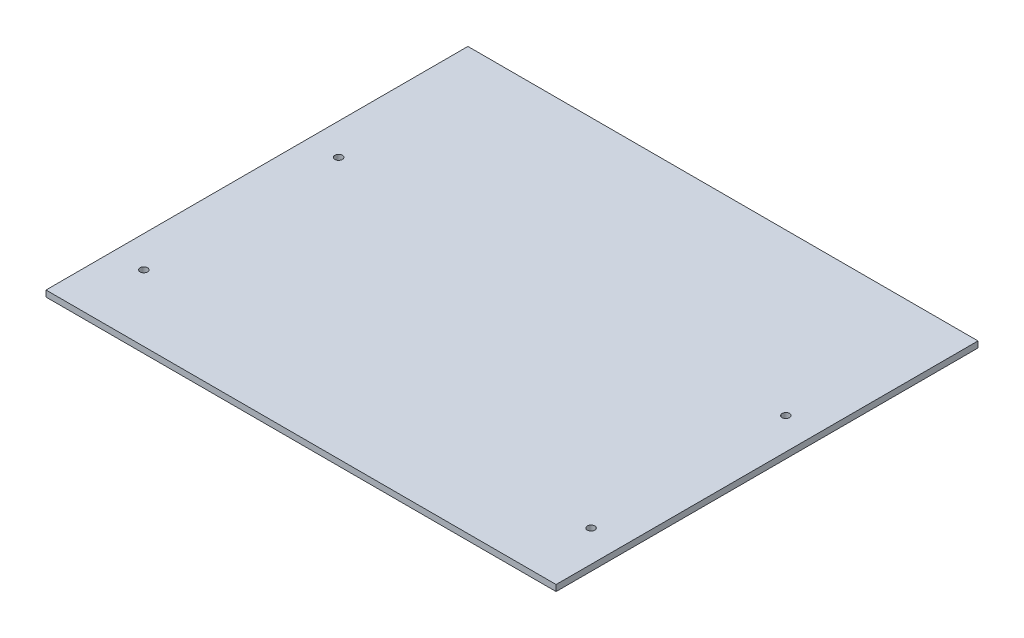
ISO-10303-21;
HEADER;
FILE_DESCRIPTION(('STEP AP214'),'2;1');
FILE_NAME('part.step','',(''),(''),'','','');
FILE_SCHEMA(('AUTOMOTIVE_DESIGN { 1 0 10303 214 1 1 1 1 }'));
ENDSEC;
DATA;
#1=APPLICATION_CONTEXT('core data for automotive mechanical design processes');
#2=APPLICATION_PROTOCOL_DEFINITION('international standard','automotive_design',2000,#1);
#3=PRODUCT_CONTEXT('',#1,'mechanical');
#4=PRODUCT('Part','Part','',(#3));
#5=PRODUCT_RELATED_PRODUCT_CATEGORY('part','',(#4));
#6=PRODUCT_DEFINITION_FORMATION('','',#4);
#7=PRODUCT_DEFINITION_CONTEXT('part definition',#1,'design');
#8=PRODUCT_DEFINITION('design','',#6,#7);
#9=PRODUCT_DEFINITION_SHAPE('','',#8);
#10=(LENGTH_UNIT() NAMED_UNIT(*) SI_UNIT(.MILLI.,.METRE.));
#11=(NAMED_UNIT(*) PLANE_ANGLE_UNIT() SI_UNIT($,.RADIAN.));
#12=(NAMED_UNIT(*) SI_UNIT($,.STERADIAN.) SOLID_ANGLE_UNIT());
#13=UNCERTAINTY_MEASURE_WITH_UNIT(LENGTH_MEASURE(1.E-05),#10,'distance_accuracy_value','');
#14=(GEOMETRIC_REPRESENTATION_CONTEXT(3) GLOBAL_UNCERTAINTY_ASSIGNED_CONTEXT((#13)) GLOBAL_UNIT_ASSIGNED_CONTEXT((#10,
#11,#12)) REPRESENTATION_CONTEXT('',''));
#15=CARTESIAN_POINT('',(0.,0.,0.));
#16=DIRECTION('',(0.,0.,1.));
#17=DIRECTION('',(1.,0.,0.));
#18=AXIS2_PLACEMENT_3D('',#15,#16,#17);
#19=CARTESIAN_POINT('',(0.,5.588,0.));
#20=DIRECTION('',(0.,-1.,0.));
#21=DIRECTION('',(0.,0.,-1.));
#22=AXIS2_PLACEMENT_3D('',#19,#20,#21);
#23=PLANE('',#22);
#24=DIRECTION('',(0.,0.,1.));
#25=VECTOR('',#24,1.);
#26=CARTESIAN_POINT('',(0.,5.588,0.));
#27=LINE('',#26,#25);
#28=CARTESIAN_POINT('',(0.,5.588,-383.413));
#29=VERTEX_POINT('',#28);
#30=CARTESIAN_POINT('',(0.,5.588,0.));
#31=VERTEX_POINT('',#30);
#32=EDGE_CURVE('E85',#29,#31,#27,.T.);
#33=ORIENTED_EDGE('',*,*,#32,.T.);
#34=DIRECTION('',(1.,0.,0.));
#35=VECTOR('',#34,1.);
#36=CARTESIAN_POINT('',(0.,5.588,0.));
#37=LINE('',#36,#35);
#38=CARTESIAN_POINT('',(463.55,5.588,0.));
#39=VERTEX_POINT('',#38);
#40=EDGE_CURVE('E80',#31,#39,#37,.T.);
#41=ORIENTED_EDGE('',*,*,#40,.T.);
#42=DIRECTION('',(0.,0.,-1.));
#43=VECTOR('',#42,1.);
#44=CARTESIAN_POINT('',(463.55,5.588,0.));
#45=LINE('',#44,#43);
#46=CARTESIAN_POINT('',(463.55,5.588,-383.413));
#47=VERTEX_POINT('',#46);
#48=EDGE_CURVE('E83',#39,#47,#45,.T.);
#49=ORIENTED_EDGE('',*,*,#48,.T.);
#50=DIRECTION('',(-1.,0.,0.));
#51=VECTOR('',#50,1.);
#52=CARTESIAN_POINT('',(0.,5.588,-383.413));
#53=LINE('',#52,#51);
#54=EDGE_CURVE('E50',#47,#29,#53,.T.);
#55=ORIENTED_EDGE('',*,*,#54,.T.);
#56=EDGE_LOOP('',(#33,#41,#49,#55));
#57=FACE_BOUND('',#56,.T.);
#58=CARTESIAN_POINT('',(28.575,5.588,-60.325));
#59=DIRECTION('',(0.,1.,0.));
#60=DIRECTION('',(0.,0.,1.));
#61=AXIS2_PLACEMENT_3D('',#58,#59,#60);
#62=CIRCLE('',#61,3.37820000000001);
#63=CARTESIAN_POINT('',(28.575,5.588,-56.9468));
#64=VERTEX_POINT('',#63);
#65=EDGE_CURVE('E100',#64,#64,#62,.T.);
#66=ORIENTED_EDGE('',*,*,#65,.F.);
#67=EDGE_LOOP('',(#66));
#68=FACE_BOUND('',#67,.T.);
#69=CARTESIAN_POINT('',(28.575,5.588,-237.363));
#70=DIRECTION('',(0.,1.,0.));
#71=DIRECTION('',(0.,0.,1.));
#72=AXIS2_PLACEMENT_3D('',#69,#70,#71);
#73=CIRCLE('',#72,3.37819999999999);
#74=CARTESIAN_POINT('',(28.575,5.588,-233.9848));
#75=VERTEX_POINT('',#74);
#76=EDGE_CURVE('E115',#75,#75,#73,.T.);
#77=ORIENTED_EDGE('',*,*,#76,.F.);
#78=EDGE_LOOP('',(#77));
#79=FACE_BOUND('',#78,.T.);
#80=CARTESIAN_POINT('',(434.975,5.588,-237.363));
#81=DIRECTION('',(0.,1.,0.));
#82=DIRECTION('',(0.,0.,-1.));
#83=AXIS2_PLACEMENT_3D('',#80,#81,#82);
#84=CIRCLE('',#83,3.37819999999999);
#85=CARTESIAN_POINT('',(434.975,5.588,-240.7412));
#86=VERTEX_POINT('',#85);
#87=EDGE_CURVE('E121',#86,#86,#84,.T.);
#88=ORIENTED_EDGE('',*,*,#87,.F.);
#89=EDGE_LOOP('',(#88));
#90=FACE_BOUND('',#89,.T.);
#91=CARTESIAN_POINT('',(434.975,5.588,-60.325));
#92=DIRECTION('',(0.,1.,0.));
#93=DIRECTION('',(0.,0.,-1.));
#94=AXIS2_PLACEMENT_3D('',#91,#92,#93);
#95=CIRCLE('',#94,3.37819999999999);
#96=CARTESIAN_POINT('',(434.975,5.588,-63.7032));
#97=VERTEX_POINT('',#96);
#98=EDGE_CURVE('E127',#97,#97,#95,.T.);
#99=ORIENTED_EDGE('',*,*,#98,.F.);
#100=EDGE_LOOP('',(#99));
#101=FACE_BOUND('',#100,.T.);
#102=ADVANCED_FACE('F33',(#57,#68,#79,#90,#101),#23,.F.);
#103=CARTESIAN_POINT('',(0.,0.,0.));
#104=DIRECTION('',(0.,-1.,0.));
#105=DIRECTION('',(0.,0.,-1.));
#106=AXIS2_PLACEMENT_3D('',#103,#104,#105);
#107=PLANE('',#106);
#108=CARTESIAN_POINT('',(434.975,0.,-237.363));
#109=DIRECTION('',(0.,1.,0.));
#110=DIRECTION('',(0.,0.,-1.));
#111=AXIS2_PLACEMENT_3D('',#108,#109,#110);
#112=CIRCLE('',#111,3.37819999999999);
#113=CARTESIAN_POINT('',(434.975,0.,-240.7412));
#114=VERTEX_POINT('',#113);
#115=EDGE_CURVE('E124',#114,#114,#112,.T.);
#116=ORIENTED_EDGE('',*,*,#115,.T.);
#117=EDGE_LOOP('',(#116));
#118=FACE_BOUND('',#117,.T.);
#119=CARTESIAN_POINT('',(28.575,0.,-60.325));
#120=DIRECTION('',(0.,1.,0.));
#121=DIRECTION('',(0.,0.,1.));
#122=AXIS2_PLACEMENT_3D('',#119,#120,#121);
#123=CIRCLE('',#122,3.37820000000001);
#124=CARTESIAN_POINT('',(28.575,0.,-56.9468));
#125=VERTEX_POINT('',#124);
#126=EDGE_CURVE('E112',#125,#125,#123,.T.);
#127=ORIENTED_EDGE('',*,*,#126,.T.);
#128=EDGE_LOOP('',(#127));
#129=FACE_BOUND('',#128,.T.);
#130=DIRECTION('',(0.,0.,1.));
#131=VECTOR('',#130,1.);
#132=CARTESIAN_POINT('',(0.,0.,0.));
#133=LINE('',#132,#131);
#134=CARTESIAN_POINT('',(0.,0.,-383.413));
#135=VERTEX_POINT('',#134);
#136=CARTESIAN_POINT('',(0.,0.,0.));
#137=VERTEX_POINT('',#136);
#138=EDGE_CURVE('E97',#135,#137,#133,.T.);
#139=ORIENTED_EDGE('',*,*,#138,.F.);
#140=DIRECTION('',(-1.,0.,0.));
#141=VECTOR('',#140,1.);
#142=CARTESIAN_POINT('',(0.,0.,-383.413));
#143=LINE('',#142,#141);
#144=CARTESIAN_POINT('',(463.55,0.,-383.413));
#145=VERTEX_POINT('',#144);
#146=EDGE_CURVE('E73',#145,#135,#143,.T.);
#147=ORIENTED_EDGE('',*,*,#146,.F.);
#148=DIRECTION('',(0.,0.,-1.));
#149=VECTOR('',#148,1.);
#150=CARTESIAN_POINT('',(463.55,0.,0.));
#151=LINE('',#150,#149);
#152=CARTESIAN_POINT('',(463.55,0.,0.));
#153=VERTEX_POINT('',#152);
#154=EDGE_CURVE('E67',#153,#145,#151,.T.);
#155=ORIENTED_EDGE('',*,*,#154,.F.);
#156=DIRECTION('',(1.,0.,0.));
#157=VECTOR('',#156,1.);
#158=CARTESIAN_POINT('',(0.,0.,0.));
#159=LINE('',#158,#157);
#160=EDGE_CURVE('E89',#137,#153,#159,.T.);
#161=ORIENTED_EDGE('',*,*,#160,.F.);
#162=EDGE_LOOP('',(#139,#147,#155,#161));
#163=FACE_BOUND('',#162,.T.);
#164=CARTESIAN_POINT('',(28.575,0.,-237.363));
#165=DIRECTION('',(0.,1.,0.));
#166=DIRECTION('',(0.,0.,1.));
#167=AXIS2_PLACEMENT_3D('',#164,#165,#166);
#168=CIRCLE('',#167,3.37819999999999);
#169=CARTESIAN_POINT('',(28.575,0.,-233.9848));
#170=VERTEX_POINT('',#169);
#171=EDGE_CURVE('E118',#170,#170,#168,.T.);
#172=ORIENTED_EDGE('',*,*,#171,.T.);
#173=EDGE_LOOP('',(#172));
#174=FACE_BOUND('',#173,.T.);
#175=CARTESIAN_POINT('',(434.975,0.,-60.325));
#176=DIRECTION('',(0.,1.,0.));
#177=DIRECTION('',(0.,0.,-1.));
#178=AXIS2_PLACEMENT_3D('',#175,#176,#177);
#179=CIRCLE('',#178,3.37819999999999);
#180=CARTESIAN_POINT('',(434.975,0.,-63.7032));
#181=VERTEX_POINT('',#180);
#182=EDGE_CURVE('E130',#181,#181,#179,.T.);
#183=ORIENTED_EDGE('',*,*,#182,.T.);
#184=EDGE_LOOP('',(#183));
#185=FACE_BOUND('',#184,.T.);
#186=ADVANCED_FACE('F108',(#118,#129,#163,#174,#185),#107,.T.);
#187=CARTESIAN_POINT('',(0.,5.588,0.));
#188=DIRECTION('',(1.,0.,0.));
#189=DIRECTION('',(0.,0.,-1.));
#190=AXIS2_PLACEMENT_3D('',#187,#188,#189);
#191=PLANE('',#190);
#192=ORIENTED_EDGE('',*,*,#138,.T.);
#193=DIRECTION('',(0.,-1.,0.));
#194=VECTOR('',#193,1.);
#195=CARTESIAN_POINT('',(0.,5.588,0.));
#196=LINE('',#195,#194);
#197=EDGE_CURVE('E11',#31,#137,#196,.T.);
#198=ORIENTED_EDGE('',*,*,#197,.F.);
#199=ORIENTED_EDGE('',*,*,#32,.F.);
#200=DIRECTION('',(0.,-1.,0.));
#201=VECTOR('',#200,1.);
#202=CARTESIAN_POINT('',(0.,5.588,-383.413));
#203=LINE('',#202,#201);
#204=EDGE_CURVE('E93',#29,#135,#203,.T.);
#205=ORIENTED_EDGE('',*,*,#204,.T.);
#206=EDGE_LOOP('',(#192,#198,#199,#205));
#207=FACE_BOUND('',#206,.T.);
#208=ADVANCED_FACE('F35',(#207),#191,.F.);
#209=CARTESIAN_POINT('',(0.,5.588,0.));
#210=DIRECTION('',(0.,0.,-1.));
#211=DIRECTION('',(-1.,0.,0.));
#212=AXIS2_PLACEMENT_3D('',#209,#210,#211);
#213=PLANE('',#212);
#214=ORIENTED_EDGE('',*,*,#160,.T.);
#215=DIRECTION('',(0.,-1.,0.));
#216=VECTOR('',#215,1.);
#217=CARTESIAN_POINT('',(463.55,5.588,0.));
#218=LINE('',#217,#216);
#219=EDGE_CURVE('E42',#39,#153,#218,.T.);
#220=ORIENTED_EDGE('',*,*,#219,.F.);
#221=ORIENTED_EDGE('',*,*,#40,.F.);
#222=ORIENTED_EDGE('',*,*,#197,.T.);
#223=EDGE_LOOP('',(#214,#220,#221,#222));
#224=FACE_BOUND('',#223,.T.);
#225=ADVANCED_FACE('F88',(#224),#213,.F.);
#226=CARTESIAN_POINT('',(463.55,5.588,0.));
#227=DIRECTION('',(-1.,0.,0.));
#228=DIRECTION('',(0.,0.,1.));
#229=AXIS2_PLACEMENT_3D('',#226,#227,#228);
#230=PLANE('',#229);
#231=ORIENTED_EDGE('',*,*,#154,.T.);
#232=DIRECTION('',(0.,-1.,0.));
#233=VECTOR('',#232,1.);
#234=CARTESIAN_POINT('',(463.55,5.588,-383.413));
#235=LINE('',#234,#233);
#236=EDGE_CURVE('E90',#47,#145,#235,.T.);
#237=ORIENTED_EDGE('',*,*,#236,.F.);
#238=ORIENTED_EDGE('',*,*,#48,.F.);
#239=ORIENTED_EDGE('',*,*,#219,.T.);
#240=EDGE_LOOP('',(#231,#237,#238,#239));
#241=FACE_BOUND('',#240,.T.);
#242=ADVANCED_FACE('F91',(#241),#230,.F.);
#243=CARTESIAN_POINT('',(0.,5.588,-383.413));
#244=DIRECTION('',(0.,0.,1.));
#245=DIRECTION('',(1.,0.,0.));
#246=AXIS2_PLACEMENT_3D('',#243,#244,#245);
#247=PLANE('',#246);
#248=ORIENTED_EDGE('',*,*,#146,.T.);
#249=ORIENTED_EDGE('',*,*,#204,.F.);
#250=ORIENTED_EDGE('',*,*,#54,.F.);
#251=ORIENTED_EDGE('',*,*,#236,.T.);
#252=EDGE_LOOP('',(#248,#249,#250,#251));
#253=FACE_BOUND('',#252,.T.);
#254=ADVANCED_FACE('F105',(#253),#247,.F.);
#255=CARTESIAN_POINT('',(28.575,5.588,-60.325));
#256=DIRECTION('',(0.,-1.,0.));
#257=DIRECTION('',(0.,0.,-1.));
#258=AXIS2_PLACEMENT_3D('',#255,#256,#257);
#259=CYLINDRICAL_SURFACE('',#258,3.37820000000001);
#260=ORIENTED_EDGE('',*,*,#65,.T.);
#261=EDGE_LOOP('',(#260));
#262=FACE_BOUND('',#261,.T.);
#263=ORIENTED_EDGE('',*,*,#126,.F.);
#264=EDGE_LOOP('',(#263));
#265=FACE_BOUND('',#264,.T.);
#266=ADVANCED_FACE('F147',(#262,#265),#259,.F.);
#267=CARTESIAN_POINT('',(28.575,5.588,-237.363));
#268=DIRECTION('',(0.,-1.,0.));
#269=DIRECTION('',(0.,0.,-1.));
#270=AXIS2_PLACEMENT_3D('',#267,#268,#269);
#271=CYLINDRICAL_SURFACE('',#270,3.37819999999999);
#272=ORIENTED_EDGE('',*,*,#76,.T.);
#273=EDGE_LOOP('',(#272));
#274=FACE_BOUND('',#273,.T.);
#275=ORIENTED_EDGE('',*,*,#171,.F.);
#276=EDGE_LOOP('',(#275));
#277=FACE_BOUND('',#276,.T.);
#278=ADVANCED_FACE('F193',(#274,#277),#271,.F.);
#279=CARTESIAN_POINT('',(434.975,5.588,-237.363));
#280=DIRECTION('',(0.,-1.,0.));
#281=DIRECTION('',(0.,0.,-1.));
#282=AXIS2_PLACEMENT_3D('',#279,#280,#281);
#283=CYLINDRICAL_SURFACE('',#282,3.37819999999999);
#284=ORIENTED_EDGE('',*,*,#87,.T.);
#285=EDGE_LOOP('',(#284));
#286=FACE_BOUND('',#285,.T.);
#287=ORIENTED_EDGE('',*,*,#115,.F.);
#288=EDGE_LOOP('',(#287));
#289=FACE_BOUND('',#288,.T.);
#290=ADVANCED_FACE('F201',(#286,#289),#283,.F.);
#291=CARTESIAN_POINT('',(434.975,5.588,-60.325));
#292=DIRECTION('',(0.,-1.,0.));
#293=DIRECTION('',(0.,0.,-1.));
#294=AXIS2_PLACEMENT_3D('',#291,#292,#293);
#295=CYLINDRICAL_SURFACE('',#294,3.37819999999999);
#296=ORIENTED_EDGE('',*,*,#98,.T.);
#297=EDGE_LOOP('',(#296));
#298=FACE_BOUND('',#297,.T.);
#299=ORIENTED_EDGE('',*,*,#182,.F.);
#300=EDGE_LOOP('',(#299));
#301=FACE_BOUND('',#300,.T.);
#302=ADVANCED_FACE('F136',(#298,#301),#295,.F.);
#303=CLOSED_SHELL('',(#102,#186,#208,#225,#242,#254,#266,#278,#290,#302));
#304=MANIFOLD_SOLID_BREP('B2',#303);
#305=ADVANCED_BREP_SHAPE_REPRESENTATION('',(#18,#304),#14);
#306=SHAPE_DEFINITION_REPRESENTATION(#9,#305);
ENDSEC;
END-ISO-10303-21;
